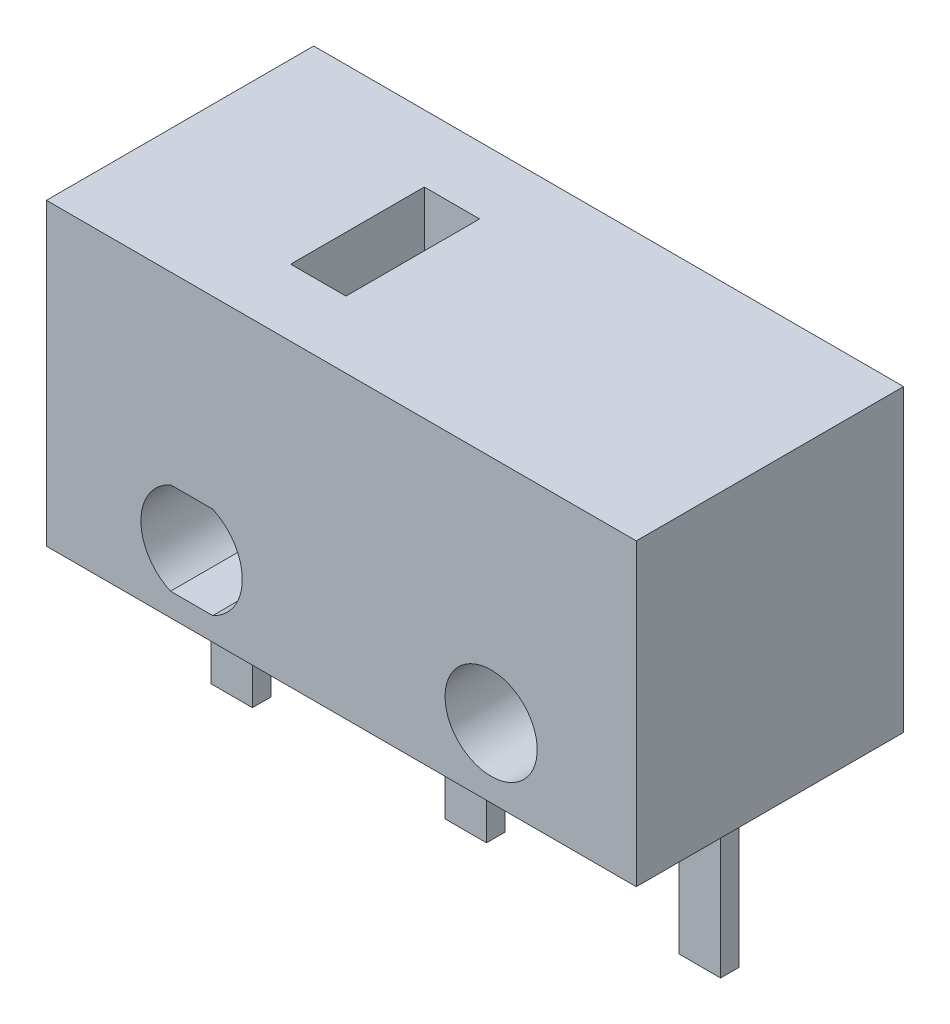
ISO-10303-21;
HEADER;
FILE_DESCRIPTION(('STEP AP214'),'2;1');
FILE_NAME('part.step','',(''),(''),'','','');
FILE_SCHEMA(('AUTOMOTIVE_DESIGN { 1 0 10303 214 1 1 1 1 }'));
ENDSEC;
DATA;
#1=APPLICATION_CONTEXT('core data for automotive mechanical design processes');
#2=APPLICATION_PROTOCOL_DEFINITION('international standard','automotive_design',2000,#1);
#3=PRODUCT_CONTEXT('',#1,'mechanical');
#4=PRODUCT('Part','Part','',(#3));
#5=PRODUCT_RELATED_PRODUCT_CATEGORY('part','',(#4));
#6=PRODUCT_DEFINITION_FORMATION('','',#4);
#7=PRODUCT_DEFINITION_CONTEXT('part definition',#1,'design');
#8=PRODUCT_DEFINITION('design','',#6,#7);
#9=PRODUCT_DEFINITION_SHAPE('','',#8);
#10=(LENGTH_UNIT() NAMED_UNIT(*) SI_UNIT(.MILLI.,.METRE.));
#11=(NAMED_UNIT(*) PLANE_ANGLE_UNIT() SI_UNIT($,.RADIAN.));
#12=(NAMED_UNIT(*) SI_UNIT($,.STERADIAN.) SOLID_ANGLE_UNIT());
#13=UNCERTAINTY_MEASURE_WITH_UNIT(LENGTH_MEASURE(1.E-05),#10,'distance_accuracy_value','');
#14=(GEOMETRIC_REPRESENTATION_CONTEXT(3) GLOBAL_UNCERTAINTY_ASSIGNED_CONTEXT((#13)) GLOBAL_UNIT_ASSIGNED_CONTEXT((#10,
#11,#12)) REPRESENTATION_CONTEXT('',''));
#15=CARTESIAN_POINT('',(0.,0.,0.));
#16=DIRECTION('',(0.,0.,1.));
#17=DIRECTION('',(1.,0.,0.));
#18=AXIS2_PLACEMENT_3D('',#15,#16,#17);
#19=CARTESIAN_POINT('',(-9.65,-1.5,2.9));
#20=DIRECTION('',(0.,1.,0.));
#21=DIRECTION('',(-1.,0.,0.));
#22=AXIS2_PLACEMENT_3D('',#19,#20,#21);
#23=PLANE('',#22);
#24=DIRECTION('',(0.,0.,-1.));
#25=VECTOR('',#24,1.);
#26=CARTESIAN_POINT('',(-3.7,-1.5,0.2));
#27=LINE('',#26,#25);
#28=CARTESIAN_POINT('',(-3.7,-1.5,0.2));
#29=VERTEX_POINT('',#28);
#30=CARTESIAN_POINT('',(-3.7,-1.5,-0.2));
#31=VERTEX_POINT('',#30);
#32=EDGE_CURVE('E248',#29,#31,#27,.T.);
#33=ORIENTED_EDGE('',*,*,#32,.F.);
#34=DIRECTION('',(-1.,0.,0.));
#35=VECTOR('',#34,1.);
#36=CARTESIAN_POINT('',(-3.7,-1.5,0.2));
#37=LINE('',#36,#35);
#38=CARTESIAN_POINT('',(-2.8,-1.5,0.2));
#39=VERTEX_POINT('',#38);
#40=EDGE_CURVE('E257',#39,#29,#37,.T.);
#41=ORIENTED_EDGE('',*,*,#40,.F.);
#42=DIRECTION('',(0.,0.,1.));
#43=VECTOR('',#42,1.);
#44=CARTESIAN_POINT('',(-2.8,-1.5,0.2));
#45=LINE('',#44,#43);
#46=CARTESIAN_POINT('',(-2.8,-1.5,-0.2));
#47=VERTEX_POINT('',#46);
#48=EDGE_CURVE('E254',#47,#39,#45,.T.);
#49=ORIENTED_EDGE('',*,*,#48,.F.);
#50=DIRECTION('',(1.,0.,0.));
#51=VECTOR('',#50,1.);
#52=CARTESIAN_POINT('',(-3.7,-1.5,-0.2));
#53=LINE('',#52,#51);
#54=EDGE_CURVE('E251',#31,#47,#53,.T.);
#55=ORIENTED_EDGE('',*,*,#54,.F.);
#56=EDGE_LOOP('',(#33,#41,#49,#55));
#57=FACE_BOUND('',#56,.T.);
#58=DIRECTION('',(1.,0.,0.));
#59=VECTOR('',#58,1.);
#60=CARTESIAN_POINT('',(-9.65,-1.5,-2.9));
#61=LINE('',#60,#59);
#62=CARTESIAN_POINT('',(-9.65,-1.5,-2.9));
#63=VERTEX_POINT('',#62);
#64=CARTESIAN_POINT('',(3.15,-1.5,-2.9));
#65=VERTEX_POINT('',#64);
#66=EDGE_CURVE('E355',#63,#65,#61,.T.);
#67=ORIENTED_EDGE('',*,*,#66,.T.);
#68=DIRECTION('',(0.,0.,-1.));
#69=VECTOR('',#68,1.);
#70=CARTESIAN_POINT('',(3.15,-1.5,2.9));
#71=LINE('',#70,#69);
#72=CARTESIAN_POINT('',(3.15,-1.5,2.9));
#73=VERTEX_POINT('',#72);
#74=EDGE_CURVE('E25',#73,#65,#71,.T.);
#75=ORIENTED_EDGE('',*,*,#74,.F.);
#76=DIRECTION('',(1.,0.,0.));
#77=VECTOR('',#76,1.);
#78=CARTESIAN_POINT('',(-9.65,-1.5,2.9));
#79=LINE('',#78,#77);
#80=CARTESIAN_POINT('',(-9.65,-1.5,2.9));
#81=VERTEX_POINT('',#80);
#82=EDGE_CURVE('E364',#81,#73,#79,.T.);
#83=ORIENTED_EDGE('',*,*,#82,.F.);
#84=DIRECTION('',(0.,0.,-1.));
#85=VECTOR('',#84,1.);
#86=CARTESIAN_POINT('',(-9.65,-1.5,2.9));
#87=LINE('',#86,#85);
#88=EDGE_CURVE('E11',#81,#63,#87,.T.);
#89=ORIENTED_EDGE('',*,*,#88,.T.);
#90=EDGE_LOOP('',(#67,#75,#83,#89));
#91=FACE_BOUND('',#90,.T.);
#92=DIRECTION('',(0.,0.,1.));
#93=VECTOR('',#92,1.);
#94=CARTESIAN_POINT('',(-7.88,-1.5,0.2));
#95=LINE('',#94,#93);
#96=CARTESIAN_POINT('',(-7.88,-1.5,-0.2));
#97=VERTEX_POINT('',#96);
#98=CARTESIAN_POINT('',(-7.88,-1.5,0.2));
#99=VERTEX_POINT('',#98);
#100=EDGE_CURVE('E281',#97,#99,#95,.T.);
#101=ORIENTED_EDGE('',*,*,#100,.F.);
#102=DIRECTION('',(1.,0.,0.));
#103=VECTOR('',#102,1.);
#104=CARTESIAN_POINT('',(-7.88,-1.5,-0.2));
#105=LINE('',#104,#103);
#106=CARTESIAN_POINT('',(-8.78,-1.5,-0.2));
#107=VERTEX_POINT('',#106);
#108=EDGE_CURVE('E290',#107,#97,#105,.T.);
#109=ORIENTED_EDGE('',*,*,#108,.F.);
#110=DIRECTION('',(0.,0.,-1.));
#111=VECTOR('',#110,1.);
#112=CARTESIAN_POINT('',(-8.78,-1.5,0.2));
#113=LINE('',#112,#111);
#114=CARTESIAN_POINT('',(-8.78,-1.5,0.2));
#115=VERTEX_POINT('',#114);
#116=EDGE_CURVE('E287',#115,#107,#113,.T.);
#117=ORIENTED_EDGE('',*,*,#116,.F.);
#118=DIRECTION('',(-1.,0.,0.));
#119=VECTOR('',#118,1.);
#120=CARTESIAN_POINT('',(-7.88,-1.5,0.2));
#121=LINE('',#120,#119);
#122=EDGE_CURVE('E284',#99,#115,#121,.T.);
#123=ORIENTED_EDGE('',*,*,#122,.F.);
#124=EDGE_LOOP('',(#101,#109,#117,#123));
#125=FACE_BOUND('',#124,.T.);
#126=DIRECTION('',(0.,0.,-1.));
#127=VECTOR('',#126,1.);
#128=CARTESIAN_POINT('',(1.38,-1.5,0.2));
#129=LINE('',#128,#127);
#130=CARTESIAN_POINT('',(1.38,-1.5,0.2));
#131=VERTEX_POINT('',#130);
#132=CARTESIAN_POINT('',(1.38,-1.5,-0.2));
#133=VERTEX_POINT('',#132);
#134=EDGE_CURVE('E216',#131,#133,#129,.T.);
#135=ORIENTED_EDGE('',*,*,#134,.F.);
#136=DIRECTION('',(-1.,0.,0.));
#137=VECTOR('',#136,1.);
#138=CARTESIAN_POINT('',(1.38,-1.5,0.2));
#139=LINE('',#138,#137);
#140=CARTESIAN_POINT('',(2.28,-1.5,0.2));
#141=VERTEX_POINT('',#140);
#142=EDGE_CURVE('E225',#141,#131,#139,.T.);
#143=ORIENTED_EDGE('',*,*,#142,.F.);
#144=DIRECTION('',(0.,0.,1.));
#145=VECTOR('',#144,1.);
#146=CARTESIAN_POINT('',(2.28,-1.5,0.2));
#147=LINE('',#146,#145);
#148=CARTESIAN_POINT('',(2.28,-1.5,-0.2));
#149=VERTEX_POINT('',#148);
#150=EDGE_CURVE('E222',#149,#141,#147,.T.);
#151=ORIENTED_EDGE('',*,*,#150,.F.);
#152=DIRECTION('',(1.,0.,0.));
#153=VECTOR('',#152,1.);
#154=CARTESIAN_POINT('',(1.38,-1.5,-0.2));
#155=LINE('',#154,#153);
#156=EDGE_CURVE('E40',#133,#149,#155,.T.);
#157=ORIENTED_EDGE('',*,*,#156,.F.);
#158=EDGE_LOOP('',(#135,#143,#151,#157));
#159=FACE_BOUND('',#158,.T.);
#160=ADVANCED_FACE('F17',(#57,#91,#125,#159),#23,.F.);
#161=CARTESIAN_POINT('',(-9.65,5.,2.9));
#162=DIRECTION('',(1.,0.,0.));
#163=DIRECTION('',(0.,0.,-1.));
#164=AXIS2_PLACEMENT_3D('',#161,#162,#163);
#165=PLANE('',#164);
#166=DIRECTION('',(0.,-1.,0.));
#167=VECTOR('',#166,1.);
#168=CARTESIAN_POINT('',(-9.65,5.,-2.9));
#169=LINE('',#168,#167);
#170=CARTESIAN_POINT('',(-9.65,5.,-2.9));
#171=VERTEX_POINT('',#170);
#172=EDGE_CURVE('E352',#171,#63,#169,.T.);
#173=ORIENTED_EDGE('',*,*,#172,.T.);
#174=ORIENTED_EDGE('',*,*,#88,.F.);
#175=DIRECTION('',(0.,-1.,0.));
#176=VECTOR('',#175,1.);
#177=CARTESIAN_POINT('',(-9.65,5.,2.9));
#178=LINE('',#177,#176);
#179=CARTESIAN_POINT('',(-9.65,5.,2.9));
#180=VERTEX_POINT('',#179);
#181=EDGE_CURVE('E361',#180,#81,#178,.T.);
#182=ORIENTED_EDGE('',*,*,#181,.F.);
#183=DIRECTION('',(0.,0.,-1.));
#184=VECTOR('',#183,1.);
#185=CARTESIAN_POINT('',(-9.65,5.,2.9));
#186=LINE('',#185,#184);
#187=EDGE_CURVE('E370',#180,#171,#186,.T.);
#188=ORIENTED_EDGE('',*,*,#187,.T.);
#189=EDGE_LOOP('',(#173,#174,#182,#188));
#190=FACE_BOUND('',#189,.T.);
#191=ADVANCED_FACE('F19',(#190),#165,.F.);
#192=CARTESIAN_POINT('',(3.15,5.,2.9));
#193=DIRECTION('',(-1.,0.,0.));
#194=DIRECTION('',(0.,0.,1.));
#195=AXIS2_PLACEMENT_3D('',#192,#193,#194);
#196=PLANE('',#195);
#197=DIRECTION('',(0.,1.,0.));
#198=VECTOR('',#197,1.);
#199=CARTESIAN_POINT('',(3.15,5.,-2.9));
#200=LINE('',#199,#198);
#201=CARTESIAN_POINT('',(3.15,5.,-2.9));
#202=VERTEX_POINT('',#201);
#203=EDGE_CURVE('E357',#65,#202,#200,.T.);
#204=ORIENTED_EDGE('',*,*,#203,.T.);
#205=DIRECTION('',(0.,0.,-1.));
#206=VECTOR('',#205,1.);
#207=CARTESIAN_POINT('',(3.15,5.,2.9));
#208=LINE('',#207,#206);
#209=CARTESIAN_POINT('',(3.15,5.,2.9));
#210=VERTEX_POINT('',#209);
#211=EDGE_CURVE('E373',#210,#202,#208,.T.);
#212=ORIENTED_EDGE('',*,*,#211,.F.);
#213=DIRECTION('',(0.,1.,0.));
#214=VECTOR('',#213,1.);
#215=CARTESIAN_POINT('',(3.15,5.,2.9));
#216=LINE('',#215,#214);
#217=EDGE_CURVE('E366',#73,#210,#216,.T.);
#218=ORIENTED_EDGE('',*,*,#217,.F.);
#219=ORIENTED_EDGE('',*,*,#74,.T.);
#220=EDGE_LOOP('',(#204,#212,#218,#219));
#221=FACE_BOUND('',#220,.T.);
#222=ADVANCED_FACE('F380',(#221),#196,.F.);
#223=CARTESIAN_POINT('',(-9.65,5.,2.9));
#224=DIRECTION('',(0.,-1.,0.));
#225=DIRECTION('',(0.,0.,-1.));
#226=AXIS2_PLACEMENT_3D('',#223,#224,#225);
#227=PLANE('',#226);
#228=DIRECTION('',(1.,0.,0.));
#229=VECTOR('',#228,1.);
#230=CARTESIAN_POINT('',(-5.8,5.,1.45));
#231=LINE('',#230,#229);
#232=CARTESIAN_POINT('',(-5.8,5.,1.45));
#233=VERTEX_POINT('',#232);
#234=CARTESIAN_POINT('',(-4.6,5.,1.45));
#235=VERTEX_POINT('',#234);
#236=EDGE_CURVE('E193',#233,#235,#231,.T.);
#237=ORIENTED_EDGE('',*,*,#236,.F.);
#238=DIRECTION('',(0.,0.,1.));
#239=VECTOR('',#238,1.);
#240=CARTESIAN_POINT('',(-5.8,5.,-1.45));
#241=LINE('',#240,#239);
#242=CARTESIAN_POINT('',(-5.8,5.,-1.45));
#243=VERTEX_POINT('',#242);
#244=EDGE_CURVE('E32',#243,#233,#241,.T.);
#245=ORIENTED_EDGE('',*,*,#244,.F.);
#246=DIRECTION('',(-1.,0.,0.));
#247=VECTOR('',#246,1.);
#248=CARTESIAN_POINT('',(-5.8,5.,-1.45));
#249=LINE('',#248,#247);
#250=CARTESIAN_POINT('',(-4.6,5.,-1.45));
#251=VERTEX_POINT('',#250);
#252=EDGE_CURVE('E200',#251,#243,#249,.T.);
#253=ORIENTED_EDGE('',*,*,#252,.F.);
#254=DIRECTION('',(0.,0.,-1.));
#255=VECTOR('',#254,1.);
#256=CARTESIAN_POINT('',(-4.6,5.,-1.45));
#257=LINE('',#256,#255);
#258=EDGE_CURVE('E182',#235,#251,#257,.T.);
#259=ORIENTED_EDGE('',*,*,#258,.F.);
#260=EDGE_LOOP('',(#237,#245,#253,#259));
#261=FACE_BOUND('',#260,.T.);
#262=DIRECTION('',(-1.,0.,0.));
#263=VECTOR('',#262,1.);
#264=CARTESIAN_POINT('',(-9.65,5.,-2.9));
#265=LINE('',#264,#263);
#266=EDGE_CURVE('E359',#202,#171,#265,.T.);
#267=ORIENTED_EDGE('',*,*,#266,.T.);
#268=ORIENTED_EDGE('',*,*,#187,.F.);
#269=DIRECTION('',(-1.,0.,0.));
#270=VECTOR('',#269,1.);
#271=CARTESIAN_POINT('',(-9.65,5.,2.9));
#272=LINE('',#271,#270);
#273=EDGE_CURVE('E368',#210,#180,#272,.T.);
#274=ORIENTED_EDGE('',*,*,#273,.F.);
#275=ORIENTED_EDGE('',*,*,#211,.T.);
#276=EDGE_LOOP('',(#267,#268,#274,#275));
#277=FACE_BOUND('',#276,.T.);
#278=ADVANCED_FACE('F197',(#261,#277),#227,.F.);
#279=CARTESIAN_POINT('',(-9.65,5.,2.9));
#280=DIRECTION('',(0.,0.,1.));
#281=DIRECTION('',(1.,0.,0.));
#282=AXIS2_PLACEMENT_3D('',#279,#280,#281);
#283=PLANE('',#282);
#284=CARTESIAN_POINT('',(-6.5,0.,2.9));
#285=DIRECTION('',(0.,0.,-1.));
#286=DIRECTION('',(-1.,0.,0.));
#287=AXIS2_PLACEMENT_3D('',#284,#285,#286);
#288=CIRCLE('',#287,1.1);
#289=CARTESIAN_POINT('',(-6.04174243050442,1.,2.9));
#290=VERTEX_POINT('',#289);
#291=CARTESIAN_POINT('',(-6.04174243050442,-1.,2.9));
#292=VERTEX_POINT('',#291);
#293=EDGE_CURVE('E325',#290,#292,#288,.T.);
#294=ORIENTED_EDGE('',*,*,#293,.T.);
#295=DIRECTION('',(-1.,0.,0.));
#296=VECTOR('',#295,1.);
#297=CARTESIAN_POINT('',(-6.04174243050442,-1.,2.9));
#298=LINE('',#297,#296);
#299=CARTESIAN_POINT('',(-6.95825756949558,-1.,2.9));
#300=VERTEX_POINT('',#299);
#301=EDGE_CURVE('E328',#292,#300,#298,.T.);
#302=ORIENTED_EDGE('',*,*,#301,.T.);
#303=CARTESIAN_POINT('',(-6.5,0.,2.9));
#304=DIRECTION('',(0.,0.,-1.));
#305=DIRECTION('',(-1.,0.,0.));
#306=AXIS2_PLACEMENT_3D('',#303,#304,#305);
#307=CIRCLE('',#306,1.1);
#308=CARTESIAN_POINT('',(-6.95825756949558,1.,2.9));
#309=VERTEX_POINT('',#308);
#310=EDGE_CURVE('E331',#300,#309,#307,.T.);
#311=ORIENTED_EDGE('',*,*,#310,.T.);
#312=DIRECTION('',(1.,0.,0.));
#313=VECTOR('',#312,1.);
#314=CARTESIAN_POINT('',(-6.04174243050442,1.,2.9));
#315=LINE('',#314,#313);
#316=EDGE_CURVE('E334',#309,#290,#315,.T.);
#317=ORIENTED_EDGE('',*,*,#316,.T.);
#318=EDGE_LOOP('',(#294,#302,#311,#317));
#319=FACE_BOUND('',#318,.T.);
#320=CARTESIAN_POINT('',(0.,0.,2.9));
#321=DIRECTION('',(0.,0.,-1.));
#322=DIRECTION('',(-1.,0.,0.));
#323=AXIS2_PLACEMENT_3D('',#320,#321,#322);
#324=CIRCLE('',#323,1.);
#325=CARTESIAN_POINT('',(-1.,0.,2.9));
#326=VERTEX_POINT('',#325);
#327=EDGE_CURVE('E349',#326,#326,#324,.T.);
#328=ORIENTED_EDGE('',*,*,#327,.T.);
#329=EDGE_LOOP('',(#328));
#330=FACE_BOUND('',#329,.T.);
#331=ORIENTED_EDGE('',*,*,#181,.T.);
#332=ORIENTED_EDGE('',*,*,#82,.T.);
#333=ORIENTED_EDGE('',*,*,#217,.T.);
#334=ORIENTED_EDGE('',*,*,#273,.T.);
#335=EDGE_LOOP('',(#331,#332,#333,#334));
#336=FACE_BOUND('',#335,.T.);
#337=ADVANCED_FACE('F393',(#319,#330,#336),#283,.T.);
#338=CARTESIAN_POINT('',(-9.65,5.,-2.9));
#339=DIRECTION('',(0.,0.,1.));
#340=DIRECTION('',(1.,0.,0.));
#341=AXIS2_PLACEMENT_3D('',#338,#339,#340);
#342=PLANE('',#341);
#343=DIRECTION('',(-1.,0.,0.));
#344=VECTOR('',#343,1.);
#345=CARTESIAN_POINT('',(-6.04174243050442,-1.,-2.9));
#346=LINE('',#345,#344);
#347=CARTESIAN_POINT('',(-6.04174243050442,-1.,-2.9));
#348=VERTEX_POINT('',#347);
#349=CARTESIAN_POINT('',(-6.95825756949558,-1.,-2.9));
#350=VERTEX_POINT('',#349);
#351=EDGE_CURVE('E316',#348,#350,#346,.T.);
#352=ORIENTED_EDGE('',*,*,#351,.F.);
#353=CARTESIAN_POINT('',(-6.5,0.,-2.9));
#354=DIRECTION('',(0.,0.,-1.));
#355=DIRECTION('',(-1.,0.,0.));
#356=AXIS2_PLACEMENT_3D('',#353,#354,#355);
#357=CIRCLE('',#356,1.1);
#358=CARTESIAN_POINT('',(-6.04174243050442,1.,-2.9));
#359=VERTEX_POINT('',#358);
#360=EDGE_CURVE('E314',#359,#348,#357,.T.);
#361=ORIENTED_EDGE('',*,*,#360,.F.);
#362=DIRECTION('',(1.,0.,0.));
#363=VECTOR('',#362,1.);
#364=CARTESIAN_POINT('',(-6.04174243050442,1.,-2.9));
#365=LINE('',#364,#363);
#366=CARTESIAN_POINT('',(-6.95825756949558,1.,-2.9));
#367=VERTEX_POINT('',#366);
#368=EDGE_CURVE('E322',#367,#359,#365,.T.);
#369=ORIENTED_EDGE('',*,*,#368,.F.);
#370=CARTESIAN_POINT('',(-6.5,0.,-2.9));
#371=DIRECTION('',(0.,0.,-1.));
#372=DIRECTION('',(-1.,0.,0.));
#373=AXIS2_PLACEMENT_3D('',#370,#371,#372);
#374=CIRCLE('',#373,1.1);
#375=EDGE_CURVE('E319',#350,#367,#374,.T.);
#376=ORIENTED_EDGE('',*,*,#375,.F.);
#377=EDGE_LOOP('',(#352,#361,#369,#376));
#378=FACE_BOUND('',#377,.T.);
#379=CARTESIAN_POINT('',(0.,0.,-2.9));
#380=DIRECTION('',(0.,0.,-1.));
#381=DIRECTION('',(-1.,0.,0.));
#382=AXIS2_PLACEMENT_3D('',#379,#380,#381);
#383=CIRCLE('',#382,1.);
#384=CARTESIAN_POINT('',(-1.,0.,-2.9));
#385=VERTEX_POINT('',#384);
#386=EDGE_CURVE('E340',#385,#385,#383,.T.);
#387=ORIENTED_EDGE('',*,*,#386,.F.);
#388=EDGE_LOOP('',(#387));
#389=FACE_BOUND('',#388,.T.);
#390=ORIENTED_EDGE('',*,*,#172,.F.);
#391=ORIENTED_EDGE('',*,*,#266,.F.);
#392=ORIENTED_EDGE('',*,*,#203,.F.);
#393=ORIENTED_EDGE('',*,*,#66,.F.);
#394=EDGE_LOOP('',(#390,#391,#392,#393));
#395=FACE_BOUND('',#394,.T.);
#396=ADVANCED_FACE('F386',(#378,#389,#395),#342,.F.);
#397=CARTESIAN_POINT('',(0.,0.,2.9));
#398=DIRECTION('',(0.,0.,-1.));
#399=DIRECTION('',(-1.,0.,0.));
#400=AXIS2_PLACEMENT_3D('',#397,#398,#399);
#401=CYLINDRICAL_SURFACE('',#400,1.);
#402=ORIENTED_EDGE('',*,*,#327,.F.);
#403=EDGE_LOOP('',(#402));
#404=FACE_BOUND('',#403,.T.);
#405=ORIENTED_EDGE('',*,*,#386,.T.);
#406=EDGE_LOOP('',(#405));
#407=FACE_BOUND('',#406,.T.);
#408=ADVANCED_FACE('F480',(#404,#407),#401,.F.);
#409=CARTESIAN_POINT('',(-6.5,0.,2.9));
#410=DIRECTION('',(0.,0.,-1.));
#411=DIRECTION('',(-1.,0.,0.));
#412=AXIS2_PLACEMENT_3D('',#409,#410,#411);
#413=CYLINDRICAL_SURFACE('',#412,1.1);
#414=ORIENTED_EDGE('',*,*,#360,.T.);
#415=DIRECTION('',(0.,0.,-1.));
#416=VECTOR('',#415,1.);
#417=CARTESIAN_POINT('',(-6.04174243050442,-1.,2.9));
#418=LINE('',#417,#416);
#419=EDGE_CURVE('E337',#292,#348,#418,.T.);
#420=ORIENTED_EDGE('',*,*,#419,.F.);
#421=ORIENTED_EDGE('',*,*,#293,.F.);
#422=DIRECTION('',(0.,0.,-1.));
#423=VECTOR('',#422,1.);
#424=CARTESIAN_POINT('',(-6.04174243050442,1.,2.9));
#425=LINE('',#424,#423);
#426=EDGE_CURVE('E338',#290,#359,#425,.T.);
#427=ORIENTED_EDGE('',*,*,#426,.T.);
#428=EDGE_LOOP('',(#414,#420,#421,#427));
#429=FACE_BOUND('',#428,.T.);
#430=ADVANCED_FACE('F470',(#429),#413,.F.);
#431=CARTESIAN_POINT('',(-6.04174243050442,1.,2.9));
#432=DIRECTION('',(0.,1.,0.));
#433=DIRECTION('',(0.,0.,1.));
#434=AXIS2_PLACEMENT_3D('',#431,#432,#433);
#435=PLANE('',#434);
#436=ORIENTED_EDGE('',*,*,#368,.T.);
#437=ORIENTED_EDGE('',*,*,#426,.F.);
#438=ORIENTED_EDGE('',*,*,#316,.F.);
#439=DIRECTION('',(0.,0.,-1.));
#440=VECTOR('',#439,1.);
#441=CARTESIAN_POINT('',(-6.95825756949558,1.,2.9));
#442=LINE('',#441,#440);
#443=EDGE_CURVE('E341',#309,#367,#442,.T.);
#444=ORIENTED_EDGE('',*,*,#443,.T.);
#445=EDGE_LOOP('',(#436,#437,#438,#444));
#446=FACE_BOUND('',#445,.T.);
#447=ADVANCED_FACE('F466',(#446),#435,.F.);
#448=CARTESIAN_POINT('',(-6.5,0.,2.9));
#449=DIRECTION('',(0.,0.,-1.));
#450=DIRECTION('',(-1.,0.,0.));
#451=AXIS2_PLACEMENT_3D('',#448,#449,#450);
#452=CYLINDRICAL_SURFACE('',#451,1.1);
#453=ORIENTED_EDGE('',*,*,#375,.T.);
#454=ORIENTED_EDGE('',*,*,#443,.F.);
#455=ORIENTED_EDGE('',*,*,#310,.F.);
#456=DIRECTION('',(0.,0.,-1.));
#457=VECTOR('',#456,1.);
#458=CARTESIAN_POINT('',(-6.95825756949558,-1.,2.9));
#459=LINE('',#458,#457);
#460=EDGE_CURVE('E343',#300,#350,#459,.T.);
#461=ORIENTED_EDGE('',*,*,#460,.T.);
#462=EDGE_LOOP('',(#453,#454,#455,#461));
#463=FACE_BOUND('',#462,.T.);
#464=ADVANCED_FACE('F469',(#463),#452,.F.);
#465=CARTESIAN_POINT('',(-6.04174243050442,-1.,2.9));
#466=DIRECTION('',(0.,-1.,0.));
#467=DIRECTION('',(1.,0.,0.));
#468=AXIS2_PLACEMENT_3D('',#465,#466,#467);
#469=PLANE('',#468);
#470=ORIENTED_EDGE('',*,*,#351,.T.);
#471=ORIENTED_EDGE('',*,*,#460,.F.);
#472=ORIENTED_EDGE('',*,*,#301,.F.);
#473=ORIENTED_EDGE('',*,*,#419,.T.);
#474=EDGE_LOOP('',(#470,#471,#472,#473));
#475=FACE_BOUND('',#474,.T.);
#476=ADVANCED_FACE('F464',(#475),#469,.F.);
#477=CARTESIAN_POINT('',(-7.88,-5.,0.2));
#478=DIRECTION('',(-1.,0.,0.));
#479=DIRECTION('',(0.,-1.,0.));
#480=AXIS2_PLACEMENT_3D('',#477,#478,#479);
#481=PLANE('',#480);
#482=ORIENTED_EDGE('',*,*,#100,.T.);
#483=DIRECTION('',(0.,1.,0.));
#484=VECTOR('',#483,1.);
#485=CARTESIAN_POINT('',(-7.88,-5.,0.2));
#486=LINE('',#485,#484);
#487=CARTESIAN_POINT('',(-7.88,-5.,0.2));
#488=VERTEX_POINT('',#487);
#489=EDGE_CURVE('E311',#488,#99,#486,.T.);
#490=ORIENTED_EDGE('',*,*,#489,.F.);
#491=DIRECTION('',(0.,0.,1.));
#492=VECTOR('',#491,1.);
#493=CARTESIAN_POINT('',(-7.88,-5.,0.2));
#494=LINE('',#493,#492);
#495=CARTESIAN_POINT('',(-7.88,-5.,-0.2));
#496=VERTEX_POINT('',#495);
#497=EDGE_CURVE('E293',#496,#488,#494,.T.);
#498=ORIENTED_EDGE('',*,*,#497,.F.);
#499=DIRECTION('',(0.,1.,0.));
#500=VECTOR('',#499,1.);
#501=CARTESIAN_POINT('',(-7.88,-5.,-0.2));
#502=LINE('',#501,#500);
#503=EDGE_CURVE('E302',#496,#97,#502,.T.);
#504=ORIENTED_EDGE('',*,*,#503,.T.);
#505=EDGE_LOOP('',(#482,#490,#498,#504));
#506=FACE_BOUND('',#505,.T.);
#507=ADVANCED_FACE('F460',(#506),#481,.F.);
#508=CARTESIAN_POINT('',(-7.88,-5.,0.2));
#509=DIRECTION('',(0.,0.,-1.));
#510=DIRECTION('',(-1.,0.,0.));
#511=AXIS2_PLACEMENT_3D('',#508,#509,#510);
#512=PLANE('',#511);
#513=ORIENTED_EDGE('',*,*,#122,.T.);
#514=DIRECTION('',(0.,1.,0.));
#515=VECTOR('',#514,1.);
#516=CARTESIAN_POINT('',(-8.78,-5.,0.2));
#517=LINE('',#516,#515);
#518=CARTESIAN_POINT('',(-8.78,-5.,0.2));
#519=VERTEX_POINT('',#518);
#520=EDGE_CURVE('E308',#519,#115,#517,.T.);
#521=ORIENTED_EDGE('',*,*,#520,.F.);
#522=DIRECTION('',(-1.,0.,0.));
#523=VECTOR('',#522,1.);
#524=CARTESIAN_POINT('',(-7.88,-5.,0.2));
#525=LINE('',#524,#523);
#526=EDGE_CURVE('E296',#488,#519,#525,.T.);
#527=ORIENTED_EDGE('',*,*,#526,.F.);
#528=ORIENTED_EDGE('',*,*,#489,.T.);
#529=EDGE_LOOP('',(#513,#521,#527,#528));
#530=FACE_BOUND('',#529,.T.);
#531=ADVANCED_FACE('F456',(#530),#512,.F.);
#532=CARTESIAN_POINT('',(-8.78,-5.,0.2));
#533=DIRECTION('',(1.,0.,0.));
#534=DIRECTION('',(0.,0.,-1.));
#535=AXIS2_PLACEMENT_3D('',#532,#533,#534);
#536=PLANE('',#535);
#537=ORIENTED_EDGE('',*,*,#116,.T.);
#538=DIRECTION('',(0.,1.,0.));
#539=VECTOR('',#538,1.);
#540=CARTESIAN_POINT('',(-8.78,-5.,-0.2));
#541=LINE('',#540,#539);
#542=CARTESIAN_POINT('',(-8.78,-5.,-0.2));
#543=VERTEX_POINT('',#542);
#544=EDGE_CURVE('E305',#543,#107,#541,.T.);
#545=ORIENTED_EDGE('',*,*,#544,.F.);
#546=DIRECTION('',(0.,0.,-1.));
#547=VECTOR('',#546,1.);
#548=CARTESIAN_POINT('',(-8.78,-5.,0.2));
#549=LINE('',#548,#547);
#550=EDGE_CURVE('E298',#519,#543,#549,.T.);
#551=ORIENTED_EDGE('',*,*,#550,.F.);
#552=ORIENTED_EDGE('',*,*,#520,.T.);
#553=EDGE_LOOP('',(#537,#545,#551,#552));
#554=FACE_BOUND('',#553,.T.);
#555=ADVANCED_FACE('F452',(#554),#536,.F.);
#556=CARTESIAN_POINT('',(-7.88,-5.,-0.2));
#557=DIRECTION('',(0.,0.,1.));
#558=DIRECTION('',(1.,0.,0.));
#559=AXIS2_PLACEMENT_3D('',#556,#557,#558);
#560=PLANE('',#559);
#561=ORIENTED_EDGE('',*,*,#108,.T.);
#562=ORIENTED_EDGE('',*,*,#503,.F.);
#563=DIRECTION('',(1.,0.,0.));
#564=VECTOR('',#563,1.);
#565=CARTESIAN_POINT('',(-7.88,-5.,-0.2));
#566=LINE('',#565,#564);
#567=EDGE_CURVE('E300',#543,#496,#566,.T.);
#568=ORIENTED_EDGE('',*,*,#567,.F.);
#569=ORIENTED_EDGE('',*,*,#544,.T.);
#570=EDGE_LOOP('',(#561,#562,#568,#569));
#571=FACE_BOUND('',#570,.T.);
#572=ADVANCED_FACE('F448',(#571),#560,.F.);
#573=CARTESIAN_POINT('',(-7.88,-5.,0.2));
#574=DIRECTION('',(0.,1.,0.));
#575=DIRECTION('',(0.,0.,1.));
#576=AXIS2_PLACEMENT_3D('',#573,#574,#575);
#577=PLANE('',#576);
#578=ORIENTED_EDGE('',*,*,#497,.T.);
#579=ORIENTED_EDGE('',*,*,#526,.T.);
#580=ORIENTED_EDGE('',*,*,#550,.T.);
#581=ORIENTED_EDGE('',*,*,#567,.T.);
#582=EDGE_LOOP('',(#578,#579,#580,#581));
#583=FACE_BOUND('',#582,.T.);
#584=ADVANCED_FACE('F444',(#583),#577,.F.);
#585=CARTESIAN_POINT('',(-3.7,-5.,0.2));
#586=DIRECTION('',(1.,0.,0.));
#587=DIRECTION('',(0.,1.,0.));
#588=AXIS2_PLACEMENT_3D('',#585,#586,#587);
#589=PLANE('',#588);
#590=ORIENTED_EDGE('',*,*,#32,.T.);
#591=DIRECTION('',(0.,1.,0.));
#592=VECTOR('',#591,1.);
#593=CARTESIAN_POINT('',(-3.7,-5.,-0.2));
#594=LINE('',#593,#592);
#595=CARTESIAN_POINT('',(-3.7,-5.,-0.2));
#596=VERTEX_POINT('',#595);
#597=EDGE_CURVE('E278',#596,#31,#594,.T.);
#598=ORIENTED_EDGE('',*,*,#597,.F.);
#599=DIRECTION('',(0.,0.,-1.));
#600=VECTOR('',#599,1.);
#601=CARTESIAN_POINT('',(-3.7,-5.,0.2));
#602=LINE('',#601,#600);
#603=CARTESIAN_POINT('',(-3.7,-5.,0.2));
#604=VERTEX_POINT('',#603);
#605=EDGE_CURVE('E260',#604,#596,#602,.T.);
#606=ORIENTED_EDGE('',*,*,#605,.F.);
#607=DIRECTION('',(0.,1.,0.));
#608=VECTOR('',#607,1.);
#609=CARTESIAN_POINT('',(-3.7,-5.,0.2));
#610=LINE('',#609,#608);
#611=EDGE_CURVE('E269',#604,#29,#610,.T.);
#612=ORIENTED_EDGE('',*,*,#611,.T.);
#613=EDGE_LOOP('',(#590,#598,#606,#612));
#614=FACE_BOUND('',#613,.T.);
#615=ADVANCED_FACE('F440',(#614),#589,.F.);
#616=CARTESIAN_POINT('',(-3.7,-5.,-0.2));
#617=DIRECTION('',(0.,0.,1.));
#618=DIRECTION('',(1.,0.,0.));
#619=AXIS2_PLACEMENT_3D('',#616,#617,#618);
#620=PLANE('',#619);
#621=ORIENTED_EDGE('',*,*,#54,.T.);
#622=DIRECTION('',(0.,1.,0.));
#623=VECTOR('',#622,1.);
#624=CARTESIAN_POINT('',(-2.8,-5.,-0.2));
#625=LINE('',#624,#623);
#626=CARTESIAN_POINT('',(-2.8,-5.,-0.2));
#627=VERTEX_POINT('',#626);
#628=EDGE_CURVE('E275',#627,#47,#625,.T.);
#629=ORIENTED_EDGE('',*,*,#628,.F.);
#630=DIRECTION('',(1.,0.,0.));
#631=VECTOR('',#630,1.);
#632=CARTESIAN_POINT('',(-3.7,-5.,-0.2));
#633=LINE('',#632,#631);
#634=EDGE_CURVE('E263',#596,#627,#633,.T.);
#635=ORIENTED_EDGE('',*,*,#634,.F.);
#636=ORIENTED_EDGE('',*,*,#597,.T.);
#637=EDGE_LOOP('',(#621,#629,#635,#636));
#638=FACE_BOUND('',#637,.T.);
#639=ADVANCED_FACE('F436',(#638),#620,.F.);
#640=CARTESIAN_POINT('',(-2.8,-5.,0.2));
#641=DIRECTION('',(-1.,0.,0.));
#642=DIRECTION('',(0.,-1.,0.));
#643=AXIS2_PLACEMENT_3D('',#640,#641,#642);
#644=PLANE('',#643);
#645=ORIENTED_EDGE('',*,*,#48,.T.);
#646=DIRECTION('',(0.,1.,0.));
#647=VECTOR('',#646,1.);
#648=CARTESIAN_POINT('',(-2.8,-5.,0.2));
#649=LINE('',#648,#647);
#650=CARTESIAN_POINT('',(-2.8,-5.,0.2));
#651=VERTEX_POINT('',#650);
#652=EDGE_CURVE('E272',#651,#39,#649,.T.);
#653=ORIENTED_EDGE('',*,*,#652,.F.);
#654=DIRECTION('',(0.,0.,1.));
#655=VECTOR('',#654,1.);
#656=CARTESIAN_POINT('',(-2.8,-5.,0.2));
#657=LINE('',#656,#655);
#658=EDGE_CURVE('E265',#627,#651,#657,.T.);
#659=ORIENTED_EDGE('',*,*,#658,.F.);
#660=ORIENTED_EDGE('',*,*,#628,.T.);
#661=EDGE_LOOP('',(#645,#653,#659,#660));
#662=FACE_BOUND('',#661,.T.);
#663=ADVANCED_FACE('F432',(#662),#644,.F.);
#664=CARTESIAN_POINT('',(-3.7,-5.,0.2));
#665=DIRECTION('',(0.,0.,-1.));
#666=DIRECTION('',(-1.,0.,0.));
#667=AXIS2_PLACEMENT_3D('',#664,#665,#666);
#668=PLANE('',#667);
#669=ORIENTED_EDGE('',*,*,#40,.T.);
#670=ORIENTED_EDGE('',*,*,#611,.F.);
#671=DIRECTION('',(-1.,0.,0.));
#672=VECTOR('',#671,1.);
#673=CARTESIAN_POINT('',(-3.7,-5.,0.2));
#674=LINE('',#673,#672);
#675=EDGE_CURVE('E267',#651,#604,#674,.T.);
#676=ORIENTED_EDGE('',*,*,#675,.F.);
#677=ORIENTED_EDGE('',*,*,#652,.T.);
#678=EDGE_LOOP('',(#669,#670,#676,#677));
#679=FACE_BOUND('',#678,.T.);
#680=ADVANCED_FACE('F428',(#679),#668,.F.);
#681=CARTESIAN_POINT('',(-3.7,-5.,-0.2));
#682=DIRECTION('',(0.,-1.,0.));
#683=DIRECTION('',(0.,0.,-1.));
#684=AXIS2_PLACEMENT_3D('',#681,#682,#683);
#685=PLANE('',#684);
#686=ORIENTED_EDGE('',*,*,#605,.T.);
#687=ORIENTED_EDGE('',*,*,#634,.T.);
#688=ORIENTED_EDGE('',*,*,#658,.T.);
#689=ORIENTED_EDGE('',*,*,#675,.T.);
#690=EDGE_LOOP('',(#686,#687,#688,#689));
#691=FACE_BOUND('',#690,.T.);
#692=ADVANCED_FACE('F422',(#691),#685,.T.);
#693=CARTESIAN_POINT('',(1.38,-5.,0.2));
#694=DIRECTION('',(1.,0.,0.));
#695=DIRECTION('',(0.,1.,0.));
#696=AXIS2_PLACEMENT_3D('',#693,#694,#695);
#697=PLANE('',#696);
#698=ORIENTED_EDGE('',*,*,#134,.T.);
#699=DIRECTION('',(0.,1.,0.));
#700=VECTOR('',#699,1.);
#701=CARTESIAN_POINT('',(1.38,-5.,-0.2));
#702=LINE('',#701,#700);
#703=CARTESIAN_POINT('',(1.38,-5.,-0.2));
#704=VERTEX_POINT('',#703);
#705=EDGE_CURVE('E246',#704,#133,#702,.T.);
#706=ORIENTED_EDGE('',*,*,#705,.F.);
#707=DIRECTION('',(0.,0.,-1.));
#708=VECTOR('',#707,1.);
#709=CARTESIAN_POINT('',(1.38,-5.,0.2));
#710=LINE('',#709,#708);
#711=CARTESIAN_POINT('',(1.38,-5.,0.2));
#712=VERTEX_POINT('',#711);
#713=EDGE_CURVE('E228',#712,#704,#710,.T.);
#714=ORIENTED_EDGE('',*,*,#713,.F.);
#715=DIRECTION('',(0.,1.,0.));
#716=VECTOR('',#715,1.);
#717=CARTESIAN_POINT('',(1.38,-5.,0.2));
#718=LINE('',#717,#716);
#719=EDGE_CURVE('E237',#712,#131,#718,.T.);
#720=ORIENTED_EDGE('',*,*,#719,.T.);
#721=EDGE_LOOP('',(#698,#706,#714,#720));
#722=FACE_BOUND('',#721,.T.);
#723=ADVANCED_FACE('F405',(#722),#697,.F.);
#724=CARTESIAN_POINT('',(1.38,-5.,-0.2));
#725=DIRECTION('',(0.,0.,1.));
#726=DIRECTION('',(1.,0.,0.));
#727=AXIS2_PLACEMENT_3D('',#724,#725,#726);
#728=PLANE('',#727);
#729=ORIENTED_EDGE('',*,*,#156,.T.);
#730=DIRECTION('',(0.,1.,0.));
#731=VECTOR('',#730,1.);
#732=CARTESIAN_POINT('',(2.28,-5.,-0.2));
#733=LINE('',#732,#731);
#734=CARTESIAN_POINT('',(2.28,-5.,-0.2));
#735=VERTEX_POINT('',#734);
#736=EDGE_CURVE('E243',#735,#149,#733,.T.);
#737=ORIENTED_EDGE('',*,*,#736,.F.);
#738=DIRECTION('',(1.,0.,0.));
#739=VECTOR('',#738,1.);
#740=CARTESIAN_POINT('',(1.38,-5.,-0.2));
#741=LINE('',#740,#739);
#742=EDGE_CURVE('E231',#704,#735,#741,.T.);
#743=ORIENTED_EDGE('',*,*,#742,.F.);
#744=ORIENTED_EDGE('',*,*,#705,.T.);
#745=EDGE_LOOP('',(#729,#737,#743,#744));
#746=FACE_BOUND('',#745,.T.);
#747=ADVANCED_FACE('F413',(#746),#728,.F.);
#748=CARTESIAN_POINT('',(2.28,-5.,0.2));
#749=DIRECTION('',(-1.,0.,0.));
#750=DIRECTION('',(0.,-1.,0.));
#751=AXIS2_PLACEMENT_3D('',#748,#749,#750);
#752=PLANE('',#751);
#753=ORIENTED_EDGE('',*,*,#150,.T.);
#754=DIRECTION('',(0.,1.,0.));
#755=VECTOR('',#754,1.);
#756=CARTESIAN_POINT('',(2.28,-5.,0.2));
#757=LINE('',#756,#755);
#758=CARTESIAN_POINT('',(2.28,-5.,0.2));
#759=VERTEX_POINT('',#758);
#760=EDGE_CURVE('E240',#759,#141,#757,.T.);
#761=ORIENTED_EDGE('',*,*,#760,.F.);
#762=DIRECTION('',(0.,0.,1.));
#763=VECTOR('',#762,1.);
#764=CARTESIAN_POINT('',(2.28,-5.,0.2));
#765=LINE('',#764,#763);
#766=EDGE_CURVE('E233',#735,#759,#765,.T.);
#767=ORIENTED_EDGE('',*,*,#766,.F.);
#768=ORIENTED_EDGE('',*,*,#736,.T.);
#769=EDGE_LOOP('',(#753,#761,#767,#768));
#770=FACE_BOUND('',#769,.T.);
#771=ADVANCED_FACE('F411',(#770),#752,.F.);
#772=CARTESIAN_POINT('',(1.38,-5.,0.2));
#773=DIRECTION('',(0.,0.,-1.));
#774=DIRECTION('',(-1.,0.,0.));
#775=AXIS2_PLACEMENT_3D('',#772,#773,#774);
#776=PLANE('',#775);
#777=ORIENTED_EDGE('',*,*,#142,.T.);
#778=ORIENTED_EDGE('',*,*,#719,.F.);
#779=DIRECTION('',(-1.,0.,0.));
#780=VECTOR('',#779,1.);
#781=CARTESIAN_POINT('',(1.38,-5.,0.2));
#782=LINE('',#781,#780);
#783=EDGE_CURVE('E235',#759,#712,#782,.T.);
#784=ORIENTED_EDGE('',*,*,#783,.F.);
#785=ORIENTED_EDGE('',*,*,#760,.T.);
#786=EDGE_LOOP('',(#777,#778,#784,#785));
#787=FACE_BOUND('',#786,.T.);
#788=ADVANCED_FACE('F401',(#787),#776,.F.);
#789=CARTESIAN_POINT('',(1.38,-5.,-0.2));
#790=DIRECTION('',(0.,-1.,0.));
#791=DIRECTION('',(0.,0.,-1.));
#792=AXIS2_PLACEMENT_3D('',#789,#790,#791);
#793=PLANE('',#792);
#794=ORIENTED_EDGE('',*,*,#713,.T.);
#795=ORIENTED_EDGE('',*,*,#742,.T.);
#796=ORIENTED_EDGE('',*,*,#766,.T.);
#797=ORIENTED_EDGE('',*,*,#783,.T.);
#798=EDGE_LOOP('',(#794,#795,#796,#797));
#799=FACE_BOUND('',#798,.T.);
#800=ADVANCED_FACE('F407',(#799),#793,.T.);
#801=CARTESIAN_POINT('',(-5.8,2.,-1.45));
#802=DIRECTION('',(-1.,0.,0.));
#803=DIRECTION('',(0.,0.,1.));
#804=AXIS2_PLACEMENT_3D('',#801,#802,#803);
#805=PLANE('',#804);
#806=ORIENTED_EDGE('',*,*,#244,.T.);
#807=DIRECTION('',(0.,1.,0.));
#808=VECTOR('',#807,1.);
#809=CARTESIAN_POINT('',(-5.8,2.,1.45));
#810=LINE('',#809,#808);
#811=CARTESIAN_POINT('',(-5.8,2.,1.45));
#812=VERTEX_POINT('',#811);
#813=EDGE_CURVE('E190',#812,#233,#810,.T.);
#814=ORIENTED_EDGE('',*,*,#813,.F.);
#815=DIRECTION('',(0.,0.,1.));
#816=VECTOR('',#815,1.);
#817=CARTESIAN_POINT('',(-5.8,2.,-1.45));
#818=LINE('',#817,#816);
#819=CARTESIAN_POINT('',(-5.8,2.,-1.45));
#820=VERTEX_POINT('',#819);
#821=EDGE_CURVE('E202',#820,#812,#818,.T.);
#822=ORIENTED_EDGE('',*,*,#821,.F.);
#823=DIRECTION('',(0.,1.,0.));
#824=VECTOR('',#823,1.);
#825=CARTESIAN_POINT('',(-5.8,2.,-1.45));
#826=LINE('',#825,#824);
#827=EDGE_CURVE('E214',#820,#243,#826,.T.);
#828=ORIENTED_EDGE('',*,*,#827,.T.);
#829=EDGE_LOOP('',(#806,#814,#822,#828));
#830=FACE_BOUND('',#829,.T.);
#831=ADVANCED_FACE('F684',(#830),#805,.F.);
#832=CARTESIAN_POINT('',(-5.8,2.,-1.45));
#833=DIRECTION('',(0.,0.,-1.));
#834=DIRECTION('',(-1.,0.,0.));
#835=AXIS2_PLACEMENT_3D('',#832,#833,#834);
#836=PLANE('',#835);
#837=ORIENTED_EDGE('',*,*,#252,.T.);
#838=ORIENTED_EDGE('',*,*,#827,.F.);
#839=DIRECTION('',(-1.,0.,0.));
#840=VECTOR('',#839,1.);
#841=CARTESIAN_POINT('',(-5.8,2.,-1.45));
#842=LINE('',#841,#840);
#843=CARTESIAN_POINT('',(-4.6,2.,-1.45));
#844=VERTEX_POINT('',#843);
#845=EDGE_CURVE('E211',#844,#820,#842,.T.);
#846=ORIENTED_EDGE('',*,*,#845,.F.);
#847=DIRECTION('',(0.,1.,0.));
#848=VECTOR('',#847,1.);
#849=CARTESIAN_POINT('',(-4.6,2.,-1.45));
#850=LINE('',#849,#848);
#851=EDGE_CURVE('E189',#844,#251,#850,.T.);
#852=ORIENTED_EDGE('',*,*,#851,.T.);
#853=EDGE_LOOP('',(#837,#838,#846,#852));
#854=FACE_BOUND('',#853,.T.);
#855=ADVANCED_FACE('F694',(#854),#836,.F.);
#856=CARTESIAN_POINT('',(-4.6,2.,-1.45));
#857=DIRECTION('',(1.,0.,0.));
#858=DIRECTION('',(0.,0.,-1.));
#859=AXIS2_PLACEMENT_3D('',#856,#857,#858);
#860=PLANE('',#859);
#861=ORIENTED_EDGE('',*,*,#258,.T.);
#862=ORIENTED_EDGE('',*,*,#851,.F.);
#863=DIRECTION('',(0.,0.,-1.));
#864=VECTOR('',#863,1.);
#865=CARTESIAN_POINT('',(-4.6,2.,-1.45));
#866=LINE('',#865,#864);
#867=CARTESIAN_POINT('',(-4.6,2.,1.45));
#868=VERTEX_POINT('',#867);
#869=EDGE_CURVE('E185',#868,#844,#866,.T.);
#870=ORIENTED_EDGE('',*,*,#869,.F.);
#871=DIRECTION('',(0.,1.,0.));
#872=VECTOR('',#871,1.);
#873=CARTESIAN_POINT('',(-4.6,2.,1.45));
#874=LINE('',#873,#872);
#875=EDGE_CURVE('E178',#868,#235,#874,.T.);
#876=ORIENTED_EDGE('',*,*,#875,.T.);
#877=EDGE_LOOP('',(#861,#862,#870,#876));
#878=FACE_BOUND('',#877,.T.);
#879=ADVANCED_FACE('F180',(#878),#860,.F.);
#880=CARTESIAN_POINT('',(-5.8,2.,1.45));
#881=DIRECTION('',(0.,0.,1.));
#882=DIRECTION('',(1.,0.,0.));
#883=AXIS2_PLACEMENT_3D('',#880,#881,#882);
#884=PLANE('',#883);
#885=ORIENTED_EDGE('',*,*,#236,.T.);
#886=ORIENTED_EDGE('',*,*,#875,.F.);
#887=DIRECTION('',(1.,0.,0.));
#888=VECTOR('',#887,1.);
#889=CARTESIAN_POINT('',(-5.8,2.,1.45));
#890=LINE('',#889,#888);
#891=EDGE_CURVE('E208',#812,#868,#890,.T.);
#892=ORIENTED_EDGE('',*,*,#891,.F.);
#893=ORIENTED_EDGE('',*,*,#813,.T.);
#894=EDGE_LOOP('',(#885,#886,#892,#893));
#895=FACE_BOUND('',#894,.T.);
#896=ADVANCED_FACE('F194',(#895),#884,.F.);
#897=CARTESIAN_POINT('',(-5.8,2.,1.45));
#898=DIRECTION('',(0.,1.,0.));
#899=DIRECTION('',(0.,0.,1.));
#900=AXIS2_PLACEMENT_3D('',#897,#898,#899);
#901=PLANE('',#900);
#902=ORIENTED_EDGE('',*,*,#821,.T.);
#903=ORIENTED_EDGE('',*,*,#891,.T.);
#904=ORIENTED_EDGE('',*,*,#869,.T.);
#905=ORIENTED_EDGE('',*,*,#845,.T.);
#906=EDGE_LOOP('',(#902,#903,#904,#905));
#907=FACE_BOUND('',#906,.T.);
#908=ADVANCED_FACE('F717',(#907),#901,.T.);
#909=CLOSED_SHELL('',(#160,#191,#222,#278,#337,#396,#408,#430,#447,#464,#476,#507,#531,#555,
#572,#584,#615,#639,#663,#680,#692,#723,#747,#771,#788,#800,#831,#855,#879,#896,#908));
#910=MANIFOLD_SOLID_BREP('B1',#909);
#911=ADVANCED_BREP_SHAPE_REPRESENTATION('',(#18,#910),#14);
#912=SHAPE_DEFINITION_REPRESENTATION(#9,#911);
ENDSEC;
END-ISO-10303-21;
